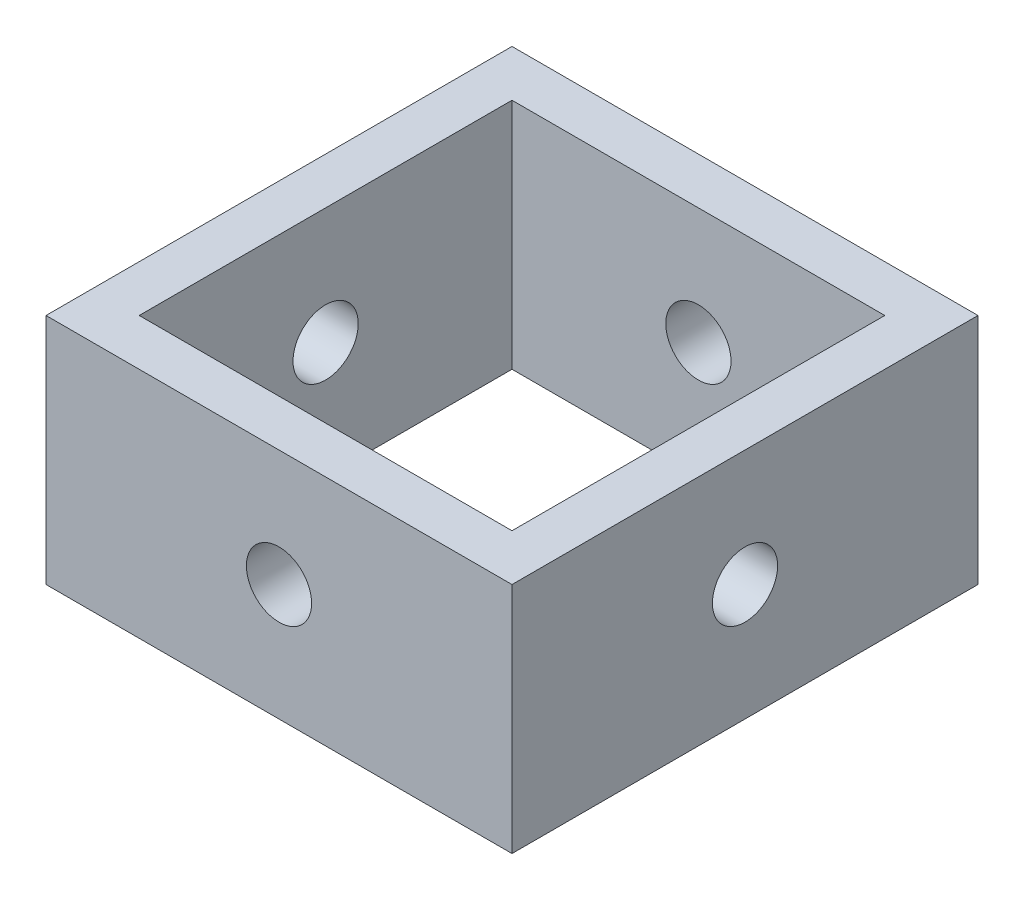
ISO-10303-21;
HEADER;
FILE_DESCRIPTION(('STEP AP214'),'2;1');
FILE_NAME('part.step','',(''),(''),'','','');
FILE_SCHEMA(('AUTOMOTIVE_DESIGN { 1 0 10303 214 1 1 1 1 }'));
ENDSEC;
DATA;
#1=APPLICATION_CONTEXT('core data for automotive mechanical design processes');
#2=APPLICATION_PROTOCOL_DEFINITION('international standard','automotive_design',2000,#1);
#3=PRODUCT_CONTEXT('',#1,'mechanical');
#4=PRODUCT('Part','Part','',(#3));
#5=PRODUCT_RELATED_PRODUCT_CATEGORY('part','',(#4));
#6=PRODUCT_DEFINITION_FORMATION('','',#4);
#7=PRODUCT_DEFINITION_CONTEXT('part definition',#1,'design');
#8=PRODUCT_DEFINITION('design','',#6,#7);
#9=PRODUCT_DEFINITION_SHAPE('','',#8);
#10=(LENGTH_UNIT() NAMED_UNIT(*) SI_UNIT(.MILLI.,.METRE.));
#11=(NAMED_UNIT(*) PLANE_ANGLE_UNIT() SI_UNIT($,.RADIAN.));
#12=(NAMED_UNIT(*) SI_UNIT($,.STERADIAN.) SOLID_ANGLE_UNIT());
#13=UNCERTAINTY_MEASURE_WITH_UNIT(LENGTH_MEASURE(1.E-05),#10,'distance_accuracy_value','');
#14=(GEOMETRIC_REPRESENTATION_CONTEXT(3) GLOBAL_UNCERTAINTY_ASSIGNED_CONTEXT((#13)) GLOBAL_UNIT_ASSIGNED_CONTEXT((#10,
#11,#12)) REPRESENTATION_CONTEXT('',''));
#15=CARTESIAN_POINT('',(0.,0.,0.));
#16=DIRECTION('',(0.,0.,1.));
#17=DIRECTION('',(1.,0.,0.));
#18=AXIS2_PLACEMENT_3D('',#15,#16,#17);
#19=CARTESIAN_POINT('',(0.,25.,0.));
#20=DIRECTION('',(0.,-1.,0.));
#21=DIRECTION('',(0.,0.,-1.));
#22=AXIS2_PLACEMENT_3D('',#19,#20,#21);
#23=PLANE('',#22);
#24=DIRECTION('',(0.,0.,-1.));
#25=VECTOR('',#24,1.);
#26=CARTESIAN_POINT('',(25.,25.,25.));
#27=LINE('',#26,#25);
#28=CARTESIAN_POINT('',(25.,25.,25.));
#29=VERTEX_POINT('',#28);
#30=CARTESIAN_POINT('',(25.,25.,-25.));
#31=VERTEX_POINT('',#30);
#32=EDGE_CURVE('E137',#29,#31,#27,.T.);
#33=ORIENTED_EDGE('',*,*,#32,.T.);
#34=DIRECTION('',(-1.,0.,0.));
#35=VECTOR('',#34,1.);
#36=CARTESIAN_POINT('',(-25.,25.,-25.));
#37=LINE('',#36,#35);
#38=CARTESIAN_POINT('',(-25.,25.,-25.));
#39=VERTEX_POINT('',#38);
#40=EDGE_CURVE('E140',#31,#39,#37,.T.);
#41=ORIENTED_EDGE('',*,*,#40,.T.);
#42=DIRECTION('',(0.,0.,1.));
#43=VECTOR('',#42,1.);
#44=CARTESIAN_POINT('',(-25.,25.,25.));
#45=LINE('',#44,#43);
#46=CARTESIAN_POINT('',(-25.,25.,25.));
#47=VERTEX_POINT('',#46);
#48=EDGE_CURVE('E143',#39,#47,#45,.T.);
#49=ORIENTED_EDGE('',*,*,#48,.T.);
#50=DIRECTION('',(1.,0.,0.));
#51=VECTOR('',#50,1.);
#52=CARTESIAN_POINT('',(-25.,25.,25.));
#53=LINE('',#52,#51);
#54=EDGE_CURVE('E145',#47,#29,#53,.T.);
#55=ORIENTED_EDGE('',*,*,#54,.T.);
#56=EDGE_LOOP('',(#33,#41,#49,#55));
#57=FACE_BOUND('',#56,.T.);
#58=DIRECTION('',(1.,0.,0.));
#59=VECTOR('',#58,1.);
#60=CARTESIAN_POINT('',(-20.,25.,20.));
#61=LINE('',#60,#59);
#62=CARTESIAN_POINT('',(-20.,25.,20.));
#63=VERTEX_POINT('',#62);
#64=CARTESIAN_POINT('',(20.,25.,20.));
#65=VERTEX_POINT('',#64);
#66=EDGE_CURVE('E99',#63,#65,#61,.T.);
#67=ORIENTED_EDGE('',*,*,#66,.F.);
#68=DIRECTION('',(0.,0.,1.));
#69=VECTOR('',#68,1.);
#70=CARTESIAN_POINT('',(-20.,25.,20.));
#71=LINE('',#70,#69);
#72=CARTESIAN_POINT('',(-20.,25.,-20.));
#73=VERTEX_POINT('',#72);
#74=EDGE_CURVE('E121',#73,#63,#71,.T.);
#75=ORIENTED_EDGE('',*,*,#74,.F.);
#76=DIRECTION('',(-1.,0.,0.));
#77=VECTOR('',#76,1.);
#78=CARTESIAN_POINT('',(-20.,25.,-20.));
#79=LINE('',#78,#77);
#80=CARTESIAN_POINT('',(20.,25.,-20.));
#81=VERTEX_POINT('',#80);
#82=EDGE_CURVE('E119',#81,#73,#79,.T.);
#83=ORIENTED_EDGE('',*,*,#82,.F.);
#84=DIRECTION('',(0.,0.,-1.));
#85=VECTOR('',#84,1.);
#86=CARTESIAN_POINT('',(20.,25.,20.));
#87=LINE('',#86,#85);
#88=EDGE_CURVE('E107',#65,#81,#87,.T.);
#89=ORIENTED_EDGE('',*,*,#88,.F.);
#90=EDGE_LOOP('',(#67,#75,#83,#89));
#91=FACE_BOUND('',#90,.T.);
#92=ADVANCED_FACE('F32',(#57,#91),#23,.F.);
#93=CARTESIAN_POINT('',(0.,0.,0.));
#94=DIRECTION('',(0.,-1.,0.));
#95=DIRECTION('',(0.,0.,-1.));
#96=AXIS2_PLACEMENT_3D('',#93,#94,#95);
#97=PLANE('',#96);
#98=DIRECTION('',(0.,0.,-1.));
#99=VECTOR('',#98,1.);
#100=CARTESIAN_POINT('',(25.,0.,25.));
#101=LINE('',#100,#99);
#102=CARTESIAN_POINT('',(25.,0.,25.));
#103=VERTEX_POINT('',#102);
#104=CARTESIAN_POINT('',(25.,0.,-25.));
#105=VERTEX_POINT('',#104);
#106=EDGE_CURVE('E115',#103,#105,#101,.T.);
#107=ORIENTED_EDGE('',*,*,#106,.F.);
#108=DIRECTION('',(1.,0.,0.));
#109=VECTOR('',#108,1.);
#110=CARTESIAN_POINT('',(-25.,0.,25.));
#111=LINE('',#110,#109);
#112=CARTESIAN_POINT('',(-25.,0.,25.));
#113=VERTEX_POINT('',#112);
#114=EDGE_CURVE('E141',#113,#103,#111,.T.);
#115=ORIENTED_EDGE('',*,*,#114,.F.);
#116=DIRECTION('',(0.,0.,1.));
#117=VECTOR('',#116,1.);
#118=CARTESIAN_POINT('',(-25.,0.,25.));
#119=LINE('',#118,#117);
#120=CARTESIAN_POINT('',(-25.,0.,-25.));
#121=VERTEX_POINT('',#120);
#122=EDGE_CURVE('E152',#121,#113,#119,.T.);
#123=ORIENTED_EDGE('',*,*,#122,.F.);
#124=DIRECTION('',(-1.,0.,0.));
#125=VECTOR('',#124,1.);
#126=CARTESIAN_POINT('',(-25.,0.,-25.));
#127=LINE('',#126,#125);
#128=EDGE_CURVE('E150',#105,#121,#127,.T.);
#129=ORIENTED_EDGE('',*,*,#128,.F.);
#130=EDGE_LOOP('',(#107,#115,#123,#129));
#131=FACE_BOUND('',#130,.T.);
#132=DIRECTION('',(0.,0.,1.));
#133=VECTOR('',#132,1.);
#134=CARTESIAN_POINT('',(-20.,0.,20.));
#135=LINE('',#134,#133);
#136=CARTESIAN_POINT('',(-20.,0.,-20.));
#137=VERTEX_POINT('',#136);
#138=CARTESIAN_POINT('',(-20.,0.,20.));
#139=VERTEX_POINT('',#138);
#140=EDGE_CURVE('E108',#137,#139,#135,.T.);
#141=ORIENTED_EDGE('',*,*,#140,.T.);
#142=DIRECTION('',(1.,0.,0.));
#143=VECTOR('',#142,1.);
#144=CARTESIAN_POINT('',(-20.,0.,20.));
#145=LINE('',#144,#143);
#146=CARTESIAN_POINT('',(20.,0.,20.));
#147=VERTEX_POINT('',#146);
#148=EDGE_CURVE('E57',#139,#147,#145,.T.);
#149=ORIENTED_EDGE('',*,*,#148,.T.);
#150=DIRECTION('',(0.,0.,-1.));
#151=VECTOR('',#150,1.);
#152=CARTESIAN_POINT('',(20.,0.,20.));
#153=LINE('',#152,#151);
#154=CARTESIAN_POINT('',(20.,0.,-20.));
#155=VERTEX_POINT('',#154);
#156=EDGE_CURVE('E114',#147,#155,#153,.T.);
#157=ORIENTED_EDGE('',*,*,#156,.T.);
#158=DIRECTION('',(-1.,0.,0.));
#159=VECTOR('',#158,1.);
#160=CARTESIAN_POINT('',(-20.,0.,-20.));
#161=LINE('',#160,#159);
#162=EDGE_CURVE('E129',#155,#137,#161,.T.);
#163=ORIENTED_EDGE('',*,*,#162,.T.);
#164=EDGE_LOOP('',(#141,#149,#157,#163));
#165=FACE_BOUND('',#164,.T.);
#166=ADVANCED_FACE('F200',(#131,#165),#97,.T.);
#167=CARTESIAN_POINT('',(25.,25.,25.));
#168=DIRECTION('',(-1.,0.,0.));
#169=DIRECTION('',(0.,0.,1.));
#170=AXIS2_PLACEMENT_3D('',#167,#168,#169);
#171=PLANE('',#170);
#172=CARTESIAN_POINT('',(25.,12.5,0.));
#173=DIRECTION('',(1.,0.,0.));
#174=DIRECTION('',(0.,0.,-1.));
#175=AXIS2_PLACEMENT_3D('',#172,#173,#174);
#176=CIRCLE('',#175,3.5);
#177=CARTESIAN_POINT('',(25.,12.5,-3.5));
#178=VERTEX_POINT('',#177);
#179=EDGE_CURVE('E164',#178,#178,#176,.T.);
#180=ORIENTED_EDGE('',*,*,#179,.F.);
#181=EDGE_LOOP('',(#180));
#182=FACE_BOUND('',#181,.T.);
#183=ORIENTED_EDGE('',*,*,#106,.T.);
#184=DIRECTION('',(0.,-1.,0.));
#185=VECTOR('',#184,1.);
#186=CARTESIAN_POINT('',(25.,25.,-25.));
#187=LINE('',#186,#185);
#188=EDGE_CURVE('E11',#31,#105,#187,.T.);
#189=ORIENTED_EDGE('',*,*,#188,.F.);
#190=ORIENTED_EDGE('',*,*,#32,.F.);
#191=DIRECTION('',(0.,-1.,0.));
#192=VECTOR('',#191,1.);
#193=CARTESIAN_POINT('',(25.,25.,25.));
#194=LINE('',#193,#192);
#195=EDGE_CURVE('E147',#29,#103,#194,.T.);
#196=ORIENTED_EDGE('',*,*,#195,.T.);
#197=EDGE_LOOP('',(#183,#189,#190,#196));
#198=FACE_BOUND('',#197,.T.);
#199=ADVANCED_FACE('F34',(#182,#198),#171,.F.);
#200=CARTESIAN_POINT('',(-25.,25.,-25.));
#201=DIRECTION('',(0.,0.,1.));
#202=DIRECTION('',(1.,0.,0.));
#203=AXIS2_PLACEMENT_3D('',#200,#201,#202);
#204=PLANE('',#203);
#205=CARTESIAN_POINT('',(0.,12.5,-25.));
#206=DIRECTION('',(0.,0.,1.));
#207=DIRECTION('',(1.,0.,0.));
#208=AXIS2_PLACEMENT_3D('',#205,#206,#207);
#209=CIRCLE('',#208,3.5);
#210=CARTESIAN_POINT('',(3.5,12.5,-25.));
#211=VERTEX_POINT('',#210);
#212=EDGE_CURVE('E170',#211,#211,#209,.T.);
#213=ORIENTED_EDGE('',*,*,#212,.T.);
#214=EDGE_LOOP('',(#213));
#215=FACE_BOUND('',#214,.T.);
#216=ORIENTED_EDGE('',*,*,#128,.T.);
#217=DIRECTION('',(0.,-1.,0.));
#218=VECTOR('',#217,1.);
#219=CARTESIAN_POINT('',(-25.,25.,-25.));
#220=LINE('',#219,#218);
#221=EDGE_CURVE('E41',#39,#121,#220,.T.);
#222=ORIENTED_EDGE('',*,*,#221,.F.);
#223=ORIENTED_EDGE('',*,*,#40,.F.);
#224=ORIENTED_EDGE('',*,*,#188,.T.);
#225=EDGE_LOOP('',(#216,#222,#223,#224));
#226=FACE_BOUND('',#225,.T.);
#227=ADVANCED_FACE('F216',(#215,#226),#204,.F.);
#228=CARTESIAN_POINT('',(-25.,25.,25.));
#229=DIRECTION('',(1.,0.,0.));
#230=DIRECTION('',(0.,0.,-1.));
#231=AXIS2_PLACEMENT_3D('',#228,#229,#230);
#232=PLANE('',#231);
#233=CARTESIAN_POINT('',(-25.,12.5,0.));
#234=DIRECTION('',(1.,0.,0.));
#235=DIRECTION('',(0.,0.,-1.));
#236=AXIS2_PLACEMENT_3D('',#233,#234,#235);
#237=CIRCLE('',#236,3.5);
#238=CARTESIAN_POINT('',(-25.,12.5,-3.5));
#239=VERTEX_POINT('',#238);
#240=EDGE_CURVE('E127',#239,#239,#237,.T.);
#241=ORIENTED_EDGE('',*,*,#240,.T.);
#242=EDGE_LOOP('',(#241));
#243=FACE_BOUND('',#242,.T.);
#244=ORIENTED_EDGE('',*,*,#122,.T.);
#245=DIRECTION('',(0.,-1.,0.));
#246=VECTOR('',#245,1.);
#247=CARTESIAN_POINT('',(-25.,25.,25.));
#248=LINE('',#247,#246);
#249=EDGE_CURVE('E157',#47,#113,#248,.T.);
#250=ORIENTED_EDGE('',*,*,#249,.F.);
#251=ORIENTED_EDGE('',*,*,#48,.F.);
#252=ORIENTED_EDGE('',*,*,#221,.T.);
#253=EDGE_LOOP('',(#244,#250,#251,#252));
#254=FACE_BOUND('',#253,.T.);
#255=ADVANCED_FACE('F181',(#243,#254),#232,.F.);
#256=CARTESIAN_POINT('',(-25.,25.,25.));
#257=DIRECTION('',(0.,0.,-1.));
#258=DIRECTION('',(-1.,0.,0.));
#259=AXIS2_PLACEMENT_3D('',#256,#257,#258);
#260=PLANE('',#259);
#261=CARTESIAN_POINT('',(0.,12.5,25.));
#262=DIRECTION('',(0.,0.,1.));
#263=DIRECTION('',(1.,0.,0.));
#264=AXIS2_PLACEMENT_3D('',#261,#262,#263);
#265=CIRCLE('',#264,3.5);
#266=CARTESIAN_POINT('',(3.5,12.5,25.));
#267=VERTEX_POINT('',#266);
#268=EDGE_CURVE('E250',#267,#267,#265,.T.);
#269=ORIENTED_EDGE('',*,*,#268,.F.);
#270=EDGE_LOOP('',(#269));
#271=FACE_BOUND('',#270,.T.);
#272=ORIENTED_EDGE('',*,*,#114,.T.);
#273=ORIENTED_EDGE('',*,*,#195,.F.);
#274=ORIENTED_EDGE('',*,*,#54,.F.);
#275=ORIENTED_EDGE('',*,*,#249,.T.);
#276=EDGE_LOOP('',(#272,#273,#274,#275));
#277=FACE_BOUND('',#276,.T.);
#278=ADVANCED_FACE('F211',(#271,#277),#260,.F.);
#279=CARTESIAN_POINT('',(-20.,25.,20.));
#280=DIRECTION('',(0.,0.,-1.));
#281=DIRECTION('',(-1.,0.,0.));
#282=AXIS2_PLACEMENT_3D('',#279,#280,#281);
#283=PLANE('',#282);
#284=CARTESIAN_POINT('',(0.,12.5,20.));
#285=DIRECTION('',(0.,0.,-1.));
#286=DIRECTION('',(-1.,0.,0.));
#287=AXIS2_PLACEMENT_3D('',#284,#285,#286);
#288=CIRCLE('',#287,3.5);
#289=CARTESIAN_POINT('',(-3.5,12.5,20.));
#290=VERTEX_POINT('',#289);
#291=EDGE_CURVE('E175',#290,#290,#288,.T.);
#292=ORIENTED_EDGE('',*,*,#291,.F.);
#293=EDGE_LOOP('',(#292));
#294=FACE_BOUND('',#293,.T.);
#295=ORIENTED_EDGE('',*,*,#148,.F.);
#296=DIRECTION('',(0.,-1.,0.));
#297=VECTOR('',#296,1.);
#298=CARTESIAN_POINT('',(-20.,25.,20.));
#299=LINE('',#298,#297);
#300=EDGE_CURVE('E103',#63,#139,#299,.T.);
#301=ORIENTED_EDGE('',*,*,#300,.F.);
#302=ORIENTED_EDGE('',*,*,#66,.T.);
#303=DIRECTION('',(0.,-1.,0.));
#304=VECTOR('',#303,1.);
#305=CARTESIAN_POINT('',(20.,25.,20.));
#306=LINE('',#305,#304);
#307=EDGE_CURVE('E102',#65,#147,#306,.T.);
#308=ORIENTED_EDGE('',*,*,#307,.T.);
#309=EDGE_LOOP('',(#295,#301,#302,#308));
#310=FACE_BOUND('',#309,.T.);
#311=ADVANCED_FACE('F101',(#294,#310),#283,.T.);
#312=CARTESIAN_POINT('',(20.,25.,20.));
#313=DIRECTION('',(-1.,0.,0.));
#314=DIRECTION('',(0.,0.,1.));
#315=AXIS2_PLACEMENT_3D('',#312,#313,#314);
#316=PLANE('',#315);
#317=CARTESIAN_POINT('',(20.,12.5,0.));
#318=DIRECTION('',(-1.,0.,0.));
#319=DIRECTION('',(0.,0.,1.));
#320=AXIS2_PLACEMENT_3D('',#317,#318,#319);
#321=CIRCLE('',#320,3.5);
#322=CARTESIAN_POINT('',(20.,12.5,3.5));
#323=VERTEX_POINT('',#322);
#324=EDGE_CURVE('E163',#323,#323,#321,.T.);
#325=ORIENTED_EDGE('',*,*,#324,.F.);
#326=EDGE_LOOP('',(#325));
#327=FACE_BOUND('',#326,.T.);
#328=ORIENTED_EDGE('',*,*,#156,.F.);
#329=ORIENTED_EDGE('',*,*,#307,.F.);
#330=ORIENTED_EDGE('',*,*,#88,.T.);
#331=DIRECTION('',(0.,-1.,0.));
#332=VECTOR('',#331,1.);
#333=CARTESIAN_POINT('',(20.,25.,-20.));
#334=LINE('',#333,#332);
#335=EDGE_CURVE('E116',#81,#155,#334,.T.);
#336=ORIENTED_EDGE('',*,*,#335,.T.);
#337=EDGE_LOOP('',(#328,#329,#330,#336));
#338=FACE_BOUND('',#337,.T.);
#339=ADVANCED_FACE('F111',(#327,#338),#316,.T.);
#340=CARTESIAN_POINT('',(-20.,25.,-20.));
#341=DIRECTION('',(0.,0.,1.));
#342=DIRECTION('',(1.,0.,0.));
#343=AXIS2_PLACEMENT_3D('',#340,#341,#342);
#344=PLANE('',#343);
#345=CARTESIAN_POINT('',(0.,12.5,-20.));
#346=DIRECTION('',(0.,0.,1.));
#347=DIRECTION('',(1.,0.,0.));
#348=AXIS2_PLACEMENT_3D('',#345,#346,#347);
#349=CIRCLE('',#348,3.5);
#350=CARTESIAN_POINT('',(3.5,12.5,-20.));
#351=VERTEX_POINT('',#350);
#352=EDGE_CURVE('E36',#351,#351,#349,.T.);
#353=ORIENTED_EDGE('',*,*,#352,.F.);
#354=EDGE_LOOP('',(#353));
#355=FACE_BOUND('',#354,.T.);
#356=ORIENTED_EDGE('',*,*,#162,.F.);
#357=ORIENTED_EDGE('',*,*,#335,.F.);
#358=ORIENTED_EDGE('',*,*,#82,.T.);
#359=DIRECTION('',(0.,-1.,0.));
#360=VECTOR('',#359,1.);
#361=CARTESIAN_POINT('',(-20.,25.,-20.));
#362=LINE('',#361,#360);
#363=EDGE_CURVE('E49',#73,#137,#362,.T.);
#364=ORIENTED_EDGE('',*,*,#363,.T.);
#365=EDGE_LOOP('',(#356,#357,#358,#364));
#366=FACE_BOUND('',#365,.T.);
#367=ADVANCED_FACE('F195',(#355,#366),#344,.T.);
#368=CARTESIAN_POINT('',(-20.,25.,20.));
#369=DIRECTION('',(1.,0.,0.));
#370=DIRECTION('',(0.,0.,-1.));
#371=AXIS2_PLACEMENT_3D('',#368,#369,#370);
#372=PLANE('',#371);
#373=CARTESIAN_POINT('',(-20.,12.5,0.));
#374=DIRECTION('',(1.,0.,0.));
#375=DIRECTION('',(0.,0.,-1.));
#376=AXIS2_PLACEMENT_3D('',#373,#374,#375);
#377=CIRCLE('',#376,3.5);
#378=CARTESIAN_POINT('',(-20.,12.5,-3.5));
#379=VERTEX_POINT('',#378);
#380=EDGE_CURVE('E161',#379,#379,#377,.T.);
#381=ORIENTED_EDGE('',*,*,#380,.F.);
#382=EDGE_LOOP('',(#381));
#383=FACE_BOUND('',#382,.T.);
#384=ORIENTED_EDGE('',*,*,#140,.F.);
#385=ORIENTED_EDGE('',*,*,#363,.F.);
#386=ORIENTED_EDGE('',*,*,#74,.T.);
#387=ORIENTED_EDGE('',*,*,#300,.T.);
#388=EDGE_LOOP('',(#384,#385,#386,#387));
#389=FACE_BOUND('',#388,.T.);
#390=ADVANCED_FACE('F187',(#383,#389),#372,.T.);
#391=CARTESIAN_POINT('',(-30.,12.5,0.));
#392=DIRECTION('',(1.,0.,0.));
#393=DIRECTION('',(0.,0.,-1.));
#394=AXIS2_PLACEMENT_3D('',#391,#392,#393);
#395=CYLINDRICAL_SURFACE('',#394,3.5);
#396=ORIENTED_EDGE('',*,*,#380,.T.);
#397=EDGE_LOOP('',(#396));
#398=FACE_BOUND('',#397,.T.);
#399=ORIENTED_EDGE('',*,*,#240,.F.);
#400=EDGE_LOOP('',(#399));
#401=FACE_BOUND('',#400,.T.);
#402=ADVANCED_FACE('F184',(#398,#401),#395,.F.);
#403=ORIENTED_EDGE('',*,*,#324,.T.);
#404=EDGE_LOOP('',(#403));
#405=FACE_BOUND('',#404,.T.);
#406=ORIENTED_EDGE('',*,*,#179,.T.);
#407=EDGE_LOOP('',(#406));
#408=FACE_BOUND('',#407,.T.);
#409=ADVANCED_FACE('F186',(#405,#408),#395,.F.);
#410=CARTESIAN_POINT('',(0.,12.5,-30.));
#411=DIRECTION('',(0.,0.,1.));
#412=DIRECTION('',(1.,0.,0.));
#413=AXIS2_PLACEMENT_3D('',#410,#411,#412);
#414=CYLINDRICAL_SURFACE('',#413,3.5);
#415=ORIENTED_EDGE('',*,*,#352,.T.);
#416=EDGE_LOOP('',(#415));
#417=FACE_BOUND('',#416,.T.);
#418=ORIENTED_EDGE('',*,*,#212,.F.);
#419=EDGE_LOOP('',(#418));
#420=FACE_BOUND('',#419,.T.);
#421=ADVANCED_FACE('F193',(#417,#420),#414,.F.);
#422=ORIENTED_EDGE('',*,*,#291,.T.);
#423=EDGE_LOOP('',(#422));
#424=FACE_BOUND('',#423,.T.);
#425=ORIENTED_EDGE('',*,*,#268,.T.);
#426=EDGE_LOOP('',(#425));
#427=FACE_BOUND('',#426,.T.);
#428=ADVANCED_FACE('F256',(#424,#427),#414,.F.);
#429=CLOSED_SHELL('',(#92,#166,#199,#227,#255,#278,#311,#339,#367,#390,#402,#409,#421,#428));
#430=MANIFOLD_SOLID_BREP('B2',#429);
#431=ADVANCED_BREP_SHAPE_REPRESENTATION('',(#18,#430),#14);
#432=SHAPE_DEFINITION_REPRESENTATION(#9,#431);
ENDSEC;
END-ISO-10303-21;
